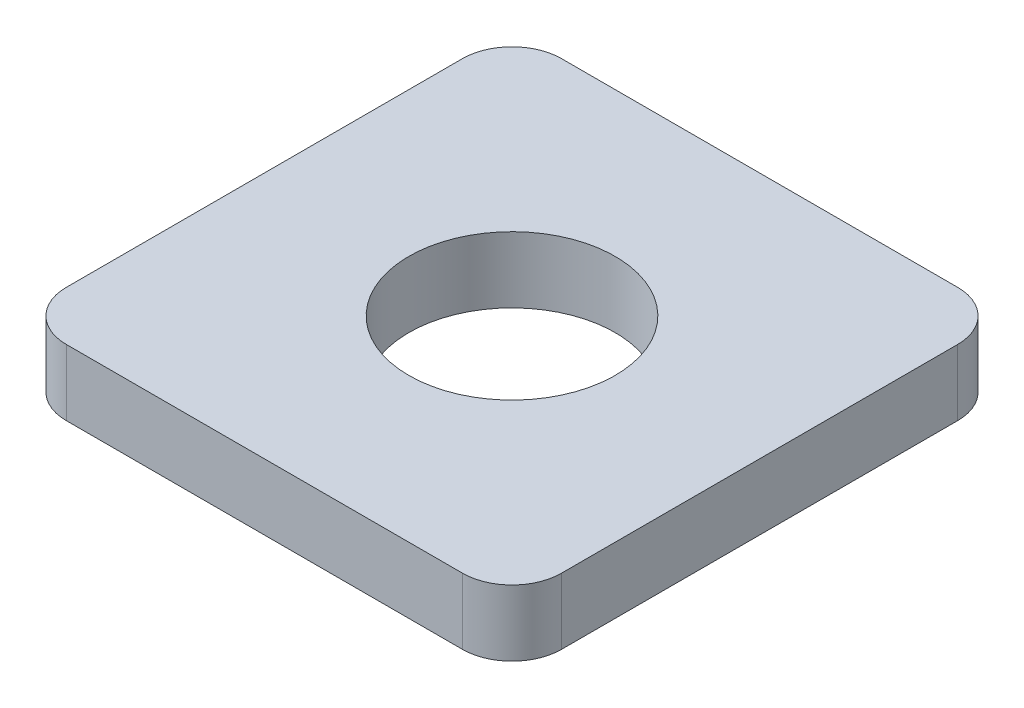
ISO-10303-21;
HEADER;
FILE_DESCRIPTION(('STEP AP214'),'2;1');
FILE_NAME('part.step','',(''),(''),'','','');
FILE_SCHEMA(('AUTOMOTIVE_DESIGN { 1 0 10303 214 1 1 1 1 }'));
ENDSEC;
DATA;
#1=APPLICATION_CONTEXT('core data for automotive mechanical design processes');
#2=APPLICATION_PROTOCOL_DEFINITION('international standard','automotive_design',2000,#1);
#3=PRODUCT_CONTEXT('',#1,'mechanical');
#4=PRODUCT('Part','Part','',(#3));
#5=PRODUCT_RELATED_PRODUCT_CATEGORY('part','',(#4));
#6=PRODUCT_DEFINITION_FORMATION('','',#4);
#7=PRODUCT_DEFINITION_CONTEXT('part definition',#1,'design');
#8=PRODUCT_DEFINITION('design','',#6,#7);
#9=PRODUCT_DEFINITION_SHAPE('','',#8);
#10=(LENGTH_UNIT() NAMED_UNIT(*) SI_UNIT(.MILLI.,.METRE.));
#11=(NAMED_UNIT(*) PLANE_ANGLE_UNIT() SI_UNIT($,.RADIAN.));
#12=(NAMED_UNIT(*) SI_UNIT($,.STERADIAN.) SOLID_ANGLE_UNIT());
#13=UNCERTAINTY_MEASURE_WITH_UNIT(LENGTH_MEASURE(1.E-05),#10,'distance_accuracy_value','');
#14=(GEOMETRIC_REPRESENTATION_CONTEXT(3) GLOBAL_UNCERTAINTY_ASSIGNED_CONTEXT((#13)) GLOBAL_UNIT_ASSIGNED_CONTEXT((#10,
#11,#12)) REPRESENTATION_CONTEXT('',''));
#15=CARTESIAN_POINT('',(0.,0.,0.));
#16=DIRECTION('',(0.,0.,1.));
#17=DIRECTION('',(1.,0.,0.));
#18=AXIS2_PLACEMENT_3D('',#15,#16,#17);
#19=CARTESIAN_POINT('',(-12.,-4.,-12.));
#20=DIRECTION('',(0.,1.,0.));
#21=DIRECTION('',(0.,0.,1.));
#22=AXIS2_PLACEMENT_3D('',#19,#20,#21);
#23=CYLINDRICAL_SURFACE('',#22,3.);
#24=CARTESIAN_POINT('',(-12.,0.,-12.));
#25=DIRECTION('',(0.,1.,0.));
#26=DIRECTION('',(0.,0.,1.));
#27=AXIS2_PLACEMENT_3D('',#24,#25,#26);
#28=CIRCLE('',#27,3.);
#29=CARTESIAN_POINT('',(-12.,0.,-15.));
#30=VERTEX_POINT('',#29);
#31=CARTESIAN_POINT('',(-15.,0.,-12.));
#32=VERTEX_POINT('',#31);
#33=EDGE_CURVE('E134',#30,#32,#28,.T.);
#34=ORIENTED_EDGE('',*,*,#33,.F.);
#35=DIRECTION('',(0.,1.,0.));
#36=VECTOR('',#35,1.);
#37=CARTESIAN_POINT('',(-12.,-4.,-15.));
#38=LINE('',#37,#36);
#39=CARTESIAN_POINT('',(-12.,-4.,-15.));
#40=VERTEX_POINT('',#39);
#41=EDGE_CURVE('E11',#40,#30,#38,.T.);
#42=ORIENTED_EDGE('',*,*,#41,.F.);
#43=CARTESIAN_POINT('',(-12.,-4.,-12.));
#44=DIRECTION('',(0.,1.,0.));
#45=DIRECTION('',(0.,0.,1.));
#46=AXIS2_PLACEMENT_3D('',#43,#44,#45);
#47=CIRCLE('',#46,3.);
#48=CARTESIAN_POINT('',(-15.,-4.,-12.));
#49=VERTEX_POINT('',#48);
#50=EDGE_CURVE('E155',#40,#49,#47,.T.);
#51=ORIENTED_EDGE('',*,*,#50,.T.);
#52=DIRECTION('',(0.,1.,0.));
#53=VECTOR('',#52,1.);
#54=CARTESIAN_POINT('',(-15.,-4.,-12.));
#55=LINE('',#54,#53);
#56=EDGE_CURVE('E40',#49,#32,#55,.T.);
#57=ORIENTED_EDGE('',*,*,#56,.T.);
#58=EDGE_LOOP('',(#34,#42,#51,#57));
#59=FACE_BOUND('',#58,.T.);
#60=ADVANCED_FACE('F37',(#59),#23,.T.);
#61=CARTESIAN_POINT('',(12.,-4.,-15.));
#62=DIRECTION('',(0.,0.,-1.));
#63=DIRECTION('',(-1.,0.,0.));
#64=AXIS2_PLACEMENT_3D('',#61,#62,#63);
#65=PLANE('',#64);
#66=DIRECTION('',(-1.,0.,0.));
#67=VECTOR('',#66,1.);
#68=CARTESIAN_POINT('',(12.,0.,-15.));
#69=LINE('',#68,#67);
#70=CARTESIAN_POINT('',(12.,0.,-15.));
#71=VERTEX_POINT('',#70);
#72=EDGE_CURVE('E153',#71,#30,#69,.T.);
#73=ORIENTED_EDGE('',*,*,#72,.F.);
#74=DIRECTION('',(0.,1.,0.));
#75=VECTOR('',#74,1.);
#76=CARTESIAN_POINT('',(12.,-4.,-15.));
#77=LINE('',#76,#75);
#78=CARTESIAN_POINT('',(12.,-4.,-15.));
#79=VERTEX_POINT('',#78);
#80=EDGE_CURVE('E46',#79,#71,#77,.T.);
#81=ORIENTED_EDGE('',*,*,#80,.F.);
#82=DIRECTION('',(-1.,0.,0.));
#83=VECTOR('',#82,1.);
#84=CARTESIAN_POINT('',(12.,-4.,-15.));
#85=LINE('',#84,#83);
#86=EDGE_CURVE('E124',#79,#40,#85,.T.);
#87=ORIENTED_EDGE('',*,*,#86,.T.);
#88=ORIENTED_EDGE('',*,*,#41,.T.);
#89=EDGE_LOOP('',(#73,#81,#87,#88));
#90=FACE_BOUND('',#89,.T.);
#91=ADVANCED_FACE('F167',(#90),#65,.T.);
#92=CARTESIAN_POINT('',(12.,-4.,-12.));
#93=DIRECTION('',(0.,1.,0.));
#94=DIRECTION('',(0.,0.,1.));
#95=AXIS2_PLACEMENT_3D('',#92,#93,#94);
#96=CYLINDRICAL_SURFACE('',#95,3.);
#97=CARTESIAN_POINT('',(12.,0.,-12.));
#98=DIRECTION('',(0.,1.,0.));
#99=DIRECTION('',(0.,0.,1.));
#100=AXIS2_PLACEMENT_3D('',#97,#98,#99);
#101=CIRCLE('',#100,3.);
#102=CARTESIAN_POINT('',(15.,0.,-12.));
#103=VERTEX_POINT('',#102);
#104=EDGE_CURVE('E111',#103,#71,#101,.T.);
#105=ORIENTED_EDGE('',*,*,#104,.F.);
#106=DIRECTION('',(0.,1.,0.));
#107=VECTOR('',#106,1.);
#108=CARTESIAN_POINT('',(15.,-4.,-12.));
#109=LINE('',#108,#107);
#110=CARTESIAN_POINT('',(15.,-4.,-12.));
#111=VERTEX_POINT('',#110);
#112=EDGE_CURVE('E106',#111,#103,#109,.T.);
#113=ORIENTED_EDGE('',*,*,#112,.F.);
#114=CARTESIAN_POINT('',(12.,-4.,-12.));
#115=DIRECTION('',(0.,1.,0.));
#116=DIRECTION('',(0.,0.,1.));
#117=AXIS2_PLACEMENT_3D('',#114,#115,#116);
#118=CIRCLE('',#117,3.);
#119=EDGE_CURVE('E109',#111,#79,#118,.T.);
#120=ORIENTED_EDGE('',*,*,#119,.T.);
#121=ORIENTED_EDGE('',*,*,#80,.T.);
#122=EDGE_LOOP('',(#105,#113,#120,#121));
#123=FACE_BOUND('',#122,.T.);
#124=ADVANCED_FACE('F108',(#123),#96,.T.);
#125=CARTESIAN_POINT('',(15.,-4.,12.));
#126=DIRECTION('',(1.,0.,0.));
#127=DIRECTION('',(0.,0.,-1.));
#128=AXIS2_PLACEMENT_3D('',#125,#126,#127);
#129=PLANE('',#128);
#130=DIRECTION('',(0.,0.,-1.));
#131=VECTOR('',#130,1.);
#132=CARTESIAN_POINT('',(15.,0.,12.));
#133=LINE('',#132,#131);
#134=CARTESIAN_POINT('',(15.,0.,12.));
#135=VERTEX_POINT('',#134);
#136=EDGE_CURVE('E150',#135,#103,#133,.T.);
#137=ORIENTED_EDGE('',*,*,#136,.F.);
#138=DIRECTION('',(0.,1.,0.));
#139=VECTOR('',#138,1.);
#140=CARTESIAN_POINT('',(15.,-4.,12.));
#141=LINE('',#140,#139);
#142=CARTESIAN_POINT('',(15.,-4.,12.));
#143=VERTEX_POINT('',#142);
#144=EDGE_CURVE('E116',#143,#135,#141,.T.);
#145=ORIENTED_EDGE('',*,*,#144,.F.);
#146=DIRECTION('',(0.,0.,-1.));
#147=VECTOR('',#146,1.);
#148=CARTESIAN_POINT('',(15.,-4.,12.));
#149=LINE('',#148,#147);
#150=EDGE_CURVE('E122',#143,#111,#149,.T.);
#151=ORIENTED_EDGE('',*,*,#150,.T.);
#152=ORIENTED_EDGE('',*,*,#112,.T.);
#153=EDGE_LOOP('',(#137,#145,#151,#152));
#154=FACE_BOUND('',#153,.T.);
#155=ADVANCED_FACE('F126',(#154),#129,.T.);
#156=CARTESIAN_POINT('',(12.,-4.,12.));
#157=DIRECTION('',(0.,1.,0.));
#158=DIRECTION('',(0.,0.,1.));
#159=AXIS2_PLACEMENT_3D('',#156,#157,#158);
#160=CYLINDRICAL_SURFACE('',#159,3.);
#161=CARTESIAN_POINT('',(12.,0.,12.));
#162=DIRECTION('',(0.,1.,0.));
#163=DIRECTION('',(0.,0.,1.));
#164=AXIS2_PLACEMENT_3D('',#161,#162,#163);
#165=CIRCLE('',#164,3.);
#166=CARTESIAN_POINT('',(12.,0.,15.));
#167=VERTEX_POINT('',#166);
#168=EDGE_CURVE('E147',#167,#135,#165,.T.);
#169=ORIENTED_EDGE('',*,*,#168,.F.);
#170=DIRECTION('',(0.,1.,0.));
#171=VECTOR('',#170,1.);
#172=CARTESIAN_POINT('',(12.,-4.,15.));
#173=LINE('',#172,#171);
#174=CARTESIAN_POINT('',(12.,-4.,15.));
#175=VERTEX_POINT('',#174);
#176=EDGE_CURVE('E159',#175,#167,#173,.T.);
#177=ORIENTED_EDGE('',*,*,#176,.F.);
#178=CARTESIAN_POINT('',(12.,-4.,12.));
#179=DIRECTION('',(0.,1.,0.));
#180=DIRECTION('',(0.,0.,1.));
#181=AXIS2_PLACEMENT_3D('',#178,#179,#180);
#182=CIRCLE('',#181,3.);
#183=EDGE_CURVE('E127',#175,#143,#182,.T.);
#184=ORIENTED_EDGE('',*,*,#183,.T.);
#185=ORIENTED_EDGE('',*,*,#144,.T.);
#186=EDGE_LOOP('',(#169,#177,#184,#185));
#187=FACE_BOUND('',#186,.T.);
#188=ADVANCED_FACE('F180',(#187),#160,.T.);
#189=CARTESIAN_POINT('',(-12.,-4.,15.));
#190=DIRECTION('',(0.,0.,1.));
#191=DIRECTION('',(1.,0.,0.));
#192=AXIS2_PLACEMENT_3D('',#189,#190,#191);
#193=PLANE('',#192);
#194=DIRECTION('',(1.,0.,0.));
#195=VECTOR('',#194,1.);
#196=CARTESIAN_POINT('',(-12.,0.,15.));
#197=LINE('',#196,#195);
#198=CARTESIAN_POINT('',(-12.,0.,15.));
#199=VERTEX_POINT('',#198);
#200=EDGE_CURVE('E144',#199,#167,#197,.T.);
#201=ORIENTED_EDGE('',*,*,#200,.F.);
#202=DIRECTION('',(0.,1.,0.));
#203=VECTOR('',#202,1.);
#204=CARTESIAN_POINT('',(-12.,-4.,15.));
#205=LINE('',#204,#203);
#206=CARTESIAN_POINT('',(-12.,-4.,15.));
#207=VERTEX_POINT('',#206);
#208=EDGE_CURVE('E161',#207,#199,#205,.T.);
#209=ORIENTED_EDGE('',*,*,#208,.F.);
#210=DIRECTION('',(1.,0.,0.));
#211=VECTOR('',#210,1.);
#212=CARTESIAN_POINT('',(-12.,-4.,15.));
#213=LINE('',#212,#211);
#214=EDGE_CURVE('E129',#207,#175,#213,.T.);
#215=ORIENTED_EDGE('',*,*,#214,.T.);
#216=ORIENTED_EDGE('',*,*,#176,.T.);
#217=EDGE_LOOP('',(#201,#209,#215,#216));
#218=FACE_BOUND('',#217,.T.);
#219=ADVANCED_FACE('F183',(#218),#193,.T.);
#220=CARTESIAN_POINT('',(-12.,-4.,12.));
#221=DIRECTION('',(0.,1.,0.));
#222=DIRECTION('',(0.,0.,1.));
#223=AXIS2_PLACEMENT_3D('',#220,#221,#222);
#224=CYLINDRICAL_SURFACE('',#223,3.);
#225=CARTESIAN_POINT('',(-12.,0.,12.));
#226=DIRECTION('',(0.,1.,0.));
#227=DIRECTION('',(0.,0.,1.));
#228=AXIS2_PLACEMENT_3D('',#225,#226,#227);
#229=CIRCLE('',#228,3.);
#230=CARTESIAN_POINT('',(-15.,0.,12.));
#231=VERTEX_POINT('',#230);
#232=EDGE_CURVE('E141',#231,#199,#229,.T.);
#233=ORIENTED_EDGE('',*,*,#232,.F.);
#234=DIRECTION('',(0.,1.,0.));
#235=VECTOR('',#234,1.);
#236=CARTESIAN_POINT('',(-15.,-4.,12.));
#237=LINE('',#236,#235);
#238=CARTESIAN_POINT('',(-15.,-4.,12.));
#239=VERTEX_POINT('',#238);
#240=EDGE_CURVE('E162',#239,#231,#237,.T.);
#241=ORIENTED_EDGE('',*,*,#240,.F.);
#242=CARTESIAN_POINT('',(-12.,-4.,12.));
#243=DIRECTION('',(0.,1.,0.));
#244=DIRECTION('',(0.,0.,1.));
#245=AXIS2_PLACEMENT_3D('',#242,#243,#244);
#246=CIRCLE('',#245,3.);
#247=EDGE_CURVE('E218',#239,#207,#246,.T.);
#248=ORIENTED_EDGE('',*,*,#247,.T.);
#249=ORIENTED_EDGE('',*,*,#208,.T.);
#250=EDGE_LOOP('',(#233,#241,#248,#249));
#251=FACE_BOUND('',#250,.T.);
#252=ADVANCED_FACE('F187',(#251),#224,.T.);
#253=CARTESIAN_POINT('',(-15.,-4.,-12.));
#254=DIRECTION('',(-1.,0.,0.));
#255=DIRECTION('',(0.,0.,1.));
#256=AXIS2_PLACEMENT_3D('',#253,#254,#255);
#257=PLANE('',#256);
#258=DIRECTION('',(0.,0.,1.));
#259=VECTOR('',#258,1.);
#260=CARTESIAN_POINT('',(-15.,0.,-12.));
#261=LINE('',#260,#259);
#262=EDGE_CURVE('E137',#32,#231,#261,.T.);
#263=ORIENTED_EDGE('',*,*,#262,.F.);
#264=ORIENTED_EDGE('',*,*,#56,.F.);
#265=DIRECTION('',(0.,0.,1.));
#266=VECTOR('',#265,1.);
#267=CARTESIAN_POINT('',(-15.,-4.,-12.));
#268=LINE('',#267,#266);
#269=EDGE_CURVE('E216',#49,#239,#268,.T.);
#270=ORIENTED_EDGE('',*,*,#269,.T.);
#271=ORIENTED_EDGE('',*,*,#240,.T.);
#272=EDGE_LOOP('',(#263,#264,#270,#271));
#273=FACE_BOUND('',#272,.T.);
#274=ADVANCED_FACE('F164',(#273),#257,.T.);
#275=CARTESIAN_POINT('',(-12.,-4.,-12.));
#276=DIRECTION('',(0.,1.,0.));
#277=DIRECTION('',(0.,0.,1.));
#278=AXIS2_PLACEMENT_3D('',#275,#276,#277);
#279=PLANE('',#278);
#280=CARTESIAN_POINT('',(0.,-4.,0.));
#281=DIRECTION('',(0.,1.,0.));
#282=DIRECTION('',(0.,0.,1.));
#283=AXIS2_PLACEMENT_3D('',#280,#281,#282);
#284=CIRCLE('',#283,6.25);
#285=CARTESIAN_POINT('',(0.,-4.,6.25));
#286=VERTEX_POINT('',#285);
#287=EDGE_CURVE('E138',#286,#286,#284,.T.);
#288=ORIENTED_EDGE('',*,*,#287,.T.);
#289=EDGE_LOOP('',(#288));
#290=FACE_BOUND('',#289,.T.);
#291=ORIENTED_EDGE('',*,*,#50,.F.);
#292=ORIENTED_EDGE('',*,*,#86,.F.);
#293=ORIENTED_EDGE('',*,*,#119,.F.);
#294=ORIENTED_EDGE('',*,*,#150,.F.);
#295=ORIENTED_EDGE('',*,*,#183,.F.);
#296=ORIENTED_EDGE('',*,*,#214,.F.);
#297=ORIENTED_EDGE('',*,*,#247,.F.);
#298=ORIENTED_EDGE('',*,*,#269,.F.);
#299=EDGE_LOOP('',(#291,#292,#293,#294,#295,#296,#297,#298));
#300=FACE_BOUND('',#299,.T.);
#301=ADVANCED_FACE('F120',(#290,#300),#279,.F.);
#302=CARTESIAN_POINT('',(-12.,0.,-12.));
#303=DIRECTION('',(0.,1.,0.));
#304=DIRECTION('',(0.,0.,1.));
#305=AXIS2_PLACEMENT_3D('',#302,#303,#304);
#306=PLANE('',#305);
#307=CARTESIAN_POINT('',(0.,0.,0.));
#308=DIRECTION('',(0.,1.,0.));
#309=DIRECTION('',(0.,0.,1.));
#310=AXIS2_PLACEMENT_3D('',#307,#308,#309);
#311=CIRCLE('',#310,6.25);
#312=CARTESIAN_POINT('',(0.,0.,6.25));
#313=VERTEX_POINT('',#312);
#314=EDGE_CURVE('E211',#313,#313,#311,.T.);
#315=ORIENTED_EDGE('',*,*,#314,.F.);
#316=EDGE_LOOP('',(#315));
#317=FACE_BOUND('',#316,.T.);
#318=ORIENTED_EDGE('',*,*,#33,.T.);
#319=ORIENTED_EDGE('',*,*,#262,.T.);
#320=ORIENTED_EDGE('',*,*,#232,.T.);
#321=ORIENTED_EDGE('',*,*,#200,.T.);
#322=ORIENTED_EDGE('',*,*,#168,.T.);
#323=ORIENTED_EDGE('',*,*,#136,.T.);
#324=ORIENTED_EDGE('',*,*,#104,.T.);
#325=ORIENTED_EDGE('',*,*,#72,.T.);
#326=EDGE_LOOP('',(#318,#319,#320,#321,#322,#323,#324,#325));
#327=FACE_BOUND('',#326,.T.);
#328=ADVANCED_FACE('F166',(#317,#327),#306,.T.);
#329=CARTESIAN_POINT('',(0.,-4.,0.));
#330=DIRECTION('',(0.,1.,0.));
#331=DIRECTION('',(0.,0.,1.));
#332=AXIS2_PLACEMENT_3D('',#329,#330,#331);
#333=CYLINDRICAL_SURFACE('',#332,6.25);
#334=ORIENTED_EDGE('',*,*,#287,.F.);
#335=EDGE_LOOP('',(#334));
#336=FACE_BOUND('',#335,.T.);
#337=ORIENTED_EDGE('',*,*,#314,.T.);
#338=EDGE_LOOP('',(#337));
#339=FACE_BOUND('',#338,.T.);
#340=ADVANCED_FACE('F199',(#336,#339),#333,.F.);
#341=CLOSED_SHELL('',(#60,#91,#124,#155,#188,#219,#252,#274,#301,#328,#340));
#342=MANIFOLD_SOLID_BREP('B2',#341);
#343=ADVANCED_BREP_SHAPE_REPRESENTATION('',(#18,#342),#14);
#344=SHAPE_DEFINITION_REPRESENTATION(#9,#343);
ENDSEC;
END-ISO-10303-21;
